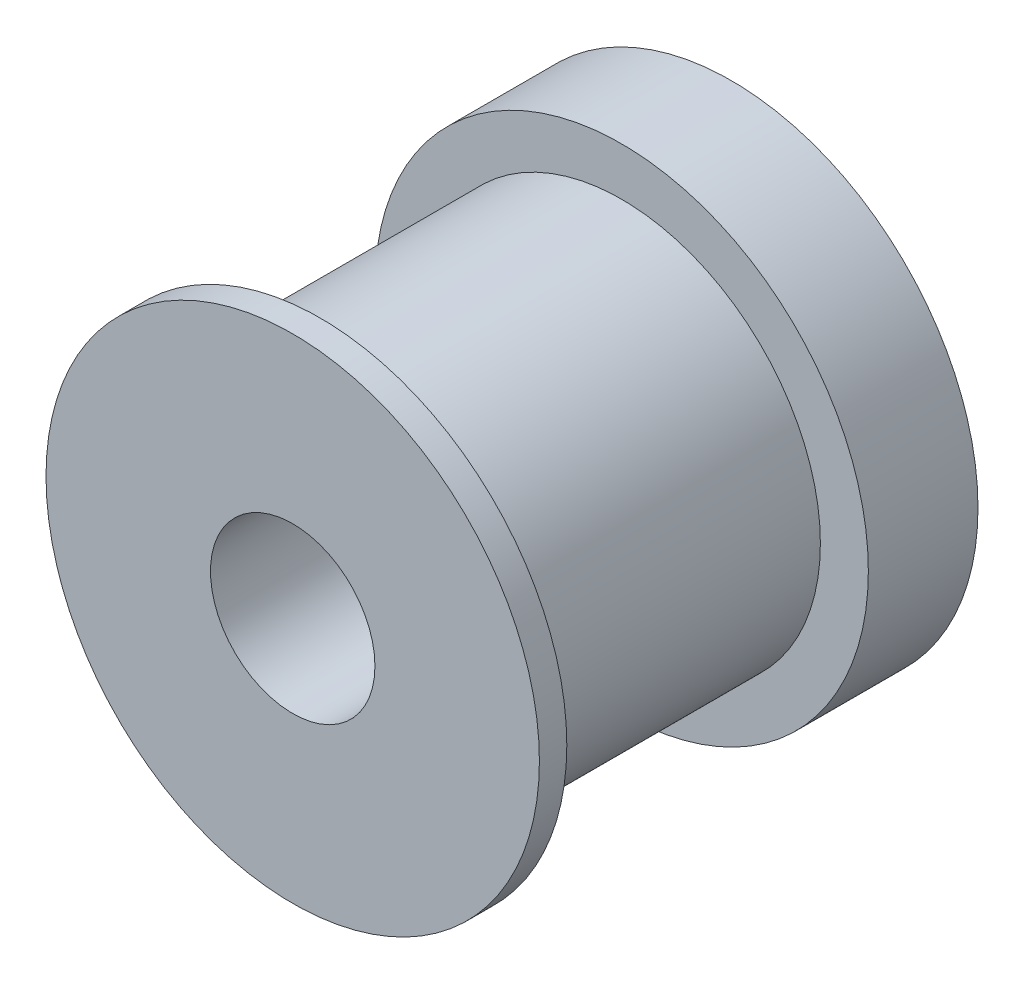
ISO-10303-21;
HEADER;
FILE_DESCRIPTION(('STEP AP214'),'2;1');
FILE_NAME('part.step','',(''),(''),'','','');
FILE_SCHEMA(('AUTOMOTIVE_DESIGN { 1 0 10303 214 1 1 1 1 }'));
ENDSEC;
DATA;
#1=APPLICATION_CONTEXT('core data for automotive mechanical design processes');
#2=APPLICATION_PROTOCOL_DEFINITION('international standard','automotive_design',2000,#1);
#3=PRODUCT_CONTEXT('',#1,'mechanical');
#4=PRODUCT('Part','Part','',(#3));
#5=PRODUCT_RELATED_PRODUCT_CATEGORY('part','',(#4));
#6=PRODUCT_DEFINITION_FORMATION('','',#4);
#7=PRODUCT_DEFINITION_CONTEXT('part definition',#1,'design');
#8=PRODUCT_DEFINITION('design','',#6,#7);
#9=PRODUCT_DEFINITION_SHAPE('','',#8);
#10=(LENGTH_UNIT() NAMED_UNIT(*) SI_UNIT(.MILLI.,.METRE.));
#11=(NAMED_UNIT(*) PLANE_ANGLE_UNIT() SI_UNIT($,.RADIAN.));
#12=(NAMED_UNIT(*) SI_UNIT($,.STERADIAN.) SOLID_ANGLE_UNIT());
#13=UNCERTAINTY_MEASURE_WITH_UNIT(LENGTH_MEASURE(1.E-05),#10,'distance_accuracy_value','');
#14=(GEOMETRIC_REPRESENTATION_CONTEXT(3) GLOBAL_UNCERTAINTY_ASSIGNED_CONTEXT((#13)) GLOBAL_UNIT_ASSIGNED_CONTEXT((#10,
#11,#12)) REPRESENTATION_CONTEXT('',''));
#15=CARTESIAN_POINT('',(0.,0.,0.));
#16=DIRECTION('',(0.,0.,1.));
#17=DIRECTION('',(1.,0.,0.));
#18=AXIS2_PLACEMENT_3D('',#15,#16,#17);
#19=CARTESIAN_POINT('',(0.,0.,5.72043271021077));
#20=DIRECTION('',(0.,0.,1.));
#21=DIRECTION('',(1.,0.,0.));
#22=AXIS2_PLACEMENT_3D('',#19,#20,#21);
#23=PLANE('',#22);
#24=CARTESIAN_POINT('',(0.,0.,5.72043271021077));
#25=DIRECTION('',(0.,0.,1.));
#26=DIRECTION('',(1.,0.,0.));
#27=AXIS2_PLACEMENT_3D('',#24,#25,#26);
#28=CIRCLE('',#27,3.625);
#29=CARTESIAN_POINT('',(3.625,0.,5.72043271021077));
#30=VERTEX_POINT('',#29);
#31=EDGE_CURVE('E10',#30,#30,#28,.T.);
#32=ORIENTED_EDGE('',*,*,#31,.F.);
#33=EDGE_LOOP('',(#32));
#34=FACE_BOUND('',#33,.T.);
#35=CARTESIAN_POINT('',(0.,0.,5.72043271021077));
#36=DIRECTION('',(0.,0.,1.));
#37=DIRECTION('',(1.,0.,0.));
#38=AXIS2_PLACEMENT_3D('',#35,#36,#37);
#39=CIRCLE('',#38,4.5);
#40=CARTESIAN_POINT('',(4.5,0.,5.72043271021077));
#41=VERTEX_POINT('',#40);
#42=EDGE_CURVE('E41',#41,#41,#39,.T.);
#43=ORIENTED_EDGE('',*,*,#42,.T.);
#44=EDGE_LOOP('',(#43));
#45=FACE_BOUND('',#44,.T.);
#46=ADVANCED_FACE('F33',(#34,#45),#23,.T.);
#47=CARTESIAN_POINT('',(0.,0.,3.72043271021077));
#48=DIRECTION('',(0.,0.,1.));
#49=DIRECTION('',(1.,0.,0.));
#50=AXIS2_PLACEMENT_3D('',#47,#48,#49);
#51=PLANE('',#50);
#52=CARTESIAN_POINT('',(0.,0.,3.72043271021077));
#53=DIRECTION('',(0.,0.,1.));
#54=DIRECTION('',(1.,0.,0.));
#55=AXIS2_PLACEMENT_3D('',#52,#53,#54);
#56=CIRCLE('',#55,4.5);
#57=CARTESIAN_POINT('',(4.5,0.,3.72043271021077));
#58=VERTEX_POINT('',#57);
#59=EDGE_CURVE('E37',#58,#58,#56,.T.);
#60=ORIENTED_EDGE('',*,*,#59,.F.);
#61=EDGE_LOOP('',(#60));
#62=FACE_BOUND('',#61,.T.);
#63=CARTESIAN_POINT('',(0.,0.,3.72043271021077));
#64=DIRECTION('',(0.,0.,1.));
#65=DIRECTION('',(1.,0.,0.));
#66=AXIS2_PLACEMENT_3D('',#63,#64,#65);
#67=CIRCLE('',#66,1.5);
#68=CARTESIAN_POINT('',(1.5,0.,3.72043271021077));
#69=VERTEX_POINT('',#68);
#70=EDGE_CURVE('E50',#69,#69,#67,.T.);
#71=ORIENTED_EDGE('',*,*,#70,.T.);
#72=EDGE_LOOP('',(#71));
#73=FACE_BOUND('',#72,.T.);
#74=ADVANCED_FACE('F86',(#62,#73),#51,.F.);
#75=CARTESIAN_POINT('',(0.,0.,5.72043271021077));
#76=DIRECTION('',(0.,0.,-1.));
#77=DIRECTION('',(-1.,0.,0.));
#78=AXIS2_PLACEMENT_3D('',#75,#76,#77);
#79=CYLINDRICAL_SURFACE('',#78,4.5);
#80=ORIENTED_EDGE('',*,*,#42,.F.);
#81=EDGE_LOOP('',(#80));
#82=FACE_BOUND('',#81,.T.);
#83=ORIENTED_EDGE('',*,*,#59,.T.);
#84=EDGE_LOOP('',(#83));
#85=FACE_BOUND('',#84,.T.);
#86=ADVANCED_FACE('F35',(#82,#85),#79,.T.);
#87=CARTESIAN_POINT('',(0.,0.,5.72043271021077));
#88=DIRECTION('',(0.,0.,-1.));
#89=DIRECTION('',(-1.,0.,0.));
#90=AXIS2_PLACEMENT_3D('',#87,#88,#89);
#91=CYLINDRICAL_SURFACE('',#90,1.5);
#92=ORIENTED_EDGE('',*,*,#70,.F.);
#93=EDGE_LOOP('',(#92));
#94=FACE_BOUND('',#93,.T.);
#95=CARTESIAN_POINT('',(0.,0.,11.7204327102108));
#96=DIRECTION('',(0.,0.,1.));
#97=DIRECTION('',(1.,0.,0.));
#98=AXIS2_PLACEMENT_3D('',#95,#96,#97);
#99=CIRCLE('',#98,1.5);
#100=CARTESIAN_POINT('',(1.5,0.,11.7204327102108));
#101=VERTEX_POINT('',#100);
#102=EDGE_CURVE('E65',#101,#101,#99,.T.);
#103=ORIENTED_EDGE('',*,*,#102,.T.);
#104=EDGE_LOOP('',(#103));
#105=FACE_BOUND('',#104,.T.);
#106=ADVANCED_FACE('F70',(#94,#105),#91,.F.);
#107=CARTESIAN_POINT('',(0.,0.,11.2204327102108));
#108=DIRECTION('',(0.,0.,-1.));
#109=DIRECTION('',(-1.,0.,0.));
#110=AXIS2_PLACEMENT_3D('',#107,#108,#109);
#111=CYLINDRICAL_SURFACE('',#110,3.625);
#112=CARTESIAN_POINT('',(0.,0.,11.2204327102108));
#113=DIRECTION('',(0.,0.,1.));
#114=DIRECTION('',(1.,0.,0.));
#115=AXIS2_PLACEMENT_3D('',#112,#113,#114);
#116=CIRCLE('',#115,3.625);
#117=CARTESIAN_POINT('',(3.625,0.,11.2204327102108));
#118=VERTEX_POINT('',#117);
#119=EDGE_CURVE('E48',#118,#118,#116,.T.);
#120=ORIENTED_EDGE('',*,*,#119,.F.);
#121=EDGE_LOOP('',(#120));
#122=FACE_BOUND('',#121,.T.);
#123=ORIENTED_EDGE('',*,*,#31,.T.);
#124=EDGE_LOOP('',(#123));
#125=FACE_BOUND('',#124,.T.);
#126=ADVANCED_FACE('F75',(#122,#125),#111,.T.);
#127=CARTESIAN_POINT('',(0.,0.,11.7204327102108));
#128=DIRECTION('',(0.,0.,1.));
#129=DIRECTION('',(1.,0.,0.));
#130=AXIS2_PLACEMENT_3D('',#127,#128,#129);
#131=PLANE('',#130);
#132=CARTESIAN_POINT('',(0.,0.,11.7204327102108));
#133=DIRECTION('',(0.,0.,1.));
#134=DIRECTION('',(1.,0.,0.));
#135=AXIS2_PLACEMENT_3D('',#132,#133,#134);
#136=CIRCLE('',#135,4.5);
#137=CARTESIAN_POINT('',(4.5,0.,11.7204327102108));
#138=VERTEX_POINT('',#137);
#139=EDGE_CURVE('E56',#138,#138,#136,.T.);
#140=ORIENTED_EDGE('',*,*,#139,.T.);
#141=EDGE_LOOP('',(#140));
#142=FACE_BOUND('',#141,.T.);
#143=ORIENTED_EDGE('',*,*,#102,.F.);
#144=EDGE_LOOP('',(#143));
#145=FACE_BOUND('',#144,.T.);
#146=ADVANCED_FACE('F72',(#142,#145),#131,.T.);
#147=CARTESIAN_POINT('',(0.,0.,11.2204327102108));
#148=DIRECTION('',(0.,0.,1.));
#149=DIRECTION('',(1.,0.,0.));
#150=AXIS2_PLACEMENT_3D('',#147,#148,#149);
#151=PLANE('',#150);
#152=ORIENTED_EDGE('',*,*,#119,.T.);
#153=EDGE_LOOP('',(#152));
#154=FACE_BOUND('',#153,.T.);
#155=CARTESIAN_POINT('',(0.,0.,11.2204327102108));
#156=DIRECTION('',(0.,0.,1.));
#157=DIRECTION('',(1.,0.,0.));
#158=AXIS2_PLACEMENT_3D('',#155,#156,#157);
#159=CIRCLE('',#158,4.5);
#160=CARTESIAN_POINT('',(4.5,0.,11.2204327102108));
#161=VERTEX_POINT('',#160);
#162=EDGE_CURVE('E60',#161,#161,#159,.T.);
#163=ORIENTED_EDGE('',*,*,#162,.F.);
#164=EDGE_LOOP('',(#163));
#165=FACE_BOUND('',#164,.T.);
#166=ADVANCED_FACE('F74',(#154,#165),#151,.F.);
#167=CARTESIAN_POINT('',(0.,0.,11.7204327102108));
#168=DIRECTION('',(0.,0.,-1.));
#169=DIRECTION('',(-1.,0.,0.));
#170=AXIS2_PLACEMENT_3D('',#167,#168,#169);
#171=CYLINDRICAL_SURFACE('',#170,4.5);
#172=ORIENTED_EDGE('',*,*,#139,.F.);
#173=EDGE_LOOP('',(#172));
#174=FACE_BOUND('',#173,.T.);
#175=ORIENTED_EDGE('',*,*,#162,.T.);
#176=EDGE_LOOP('',(#175));
#177=FACE_BOUND('',#176,.T.);
#178=ADVANCED_FACE('F81',(#174,#177),#171,.T.);
#179=CLOSED_SHELL('',(#46,#74,#86,#106,#126,#146,#166,#178));
#180=MANIFOLD_SOLID_BREP('B2',#179);
#181=ADVANCED_BREP_SHAPE_REPRESENTATION('',(#18,#180),#14);
#182=SHAPE_DEFINITION_REPRESENTATION(#9,#181);
ENDSEC;
END-ISO-10303-21;
